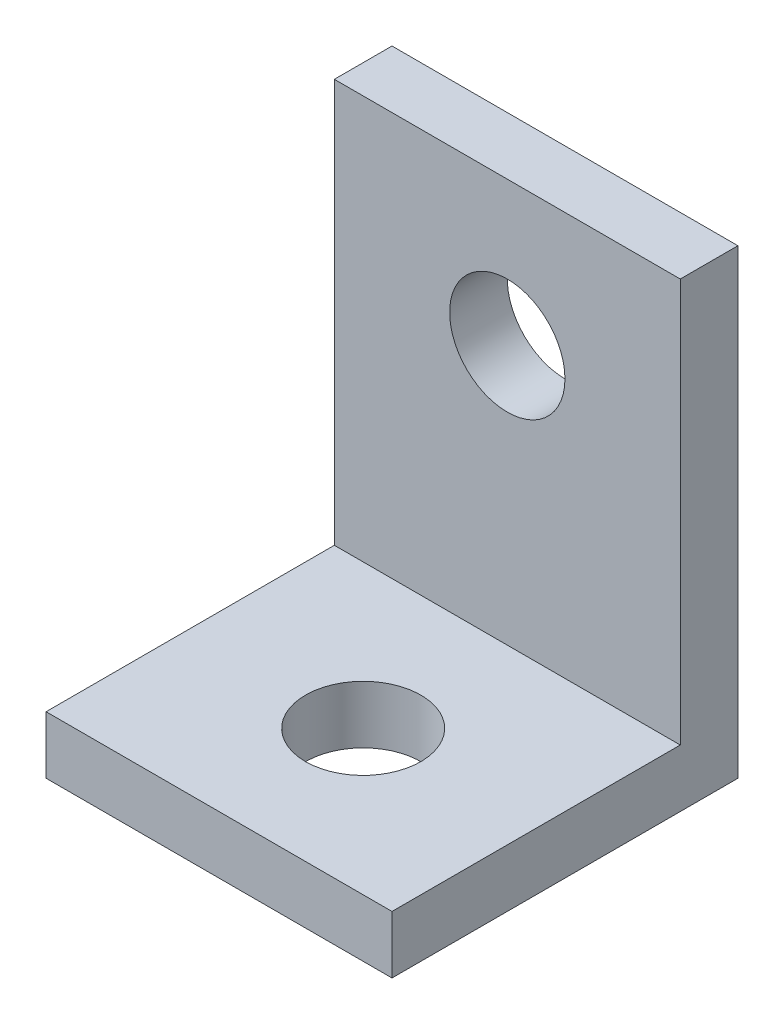
ISO-10303-21;
HEADER;
FILE_DESCRIPTION(('STEP AP214'),'2;1');
FILE_NAME('part.step','',(''),(''),'','','');
FILE_SCHEMA(('AUTOMOTIVE_DESIGN { 1 0 10303 214 1 1 1 1 }'));
ENDSEC;
DATA;
#1=APPLICATION_CONTEXT('core data for automotive mechanical design processes');
#2=APPLICATION_PROTOCOL_DEFINITION('international standard','automotive_design',2000,#1);
#3=PRODUCT_CONTEXT('',#1,'mechanical');
#4=PRODUCT('Part','Part','',(#3));
#5=PRODUCT_RELATED_PRODUCT_CATEGORY('part','',(#4));
#6=PRODUCT_DEFINITION_FORMATION('','',#4);
#7=PRODUCT_DEFINITION_CONTEXT('part definition',#1,'design');
#8=PRODUCT_DEFINITION('design','',#6,#7);
#9=PRODUCT_DEFINITION_SHAPE('','',#8);
#10=(LENGTH_UNIT() NAMED_UNIT(*) SI_UNIT(.MILLI.,.METRE.));
#11=(NAMED_UNIT(*) PLANE_ANGLE_UNIT() SI_UNIT($,.RADIAN.));
#12=(NAMED_UNIT(*) SI_UNIT($,.STERADIAN.) SOLID_ANGLE_UNIT());
#13=UNCERTAINTY_MEASURE_WITH_UNIT(LENGTH_MEASURE(1.E-05),#10,'distance_accuracy_value','');
#14=(GEOMETRIC_REPRESENTATION_CONTEXT(3) GLOBAL_UNCERTAINTY_ASSIGNED_CONTEXT((#13)) GLOBAL_UNIT_ASSIGNED_CONTEXT((#10,
#11,#12)) REPRESENTATION_CONTEXT('',''));
#15=CARTESIAN_POINT('',(0.,0.,0.));
#16=DIRECTION('',(0.,0.,1.));
#17=DIRECTION('',(1.,0.,0.));
#18=AXIS2_PLACEMENT_3D('',#15,#16,#17);
#19=CARTESIAN_POINT('',(0.,3.175,0.));
#20=DIRECTION('',(1.,0.,0.));
#21=DIRECTION('',(0.,0.,-1.));
#22=AXIS2_PLACEMENT_3D('',#19,#20,#21);
#23=PLANE('',#22);
#24=DIRECTION('',(0.,0.,1.));
#25=VECTOR('',#24,1.);
#26=CARTESIAN_POINT('',(0.,0.,0.));
#27=LINE('',#26,#25);
#28=CARTESIAN_POINT('',(0.,0.,0.));
#29=VERTEX_POINT('',#28);
#30=CARTESIAN_POINT('',(0.,0.,19.05));
#31=VERTEX_POINT('',#30);
#32=EDGE_CURVE('E97',#29,#31,#27,.T.);
#33=ORIENTED_EDGE('',*,*,#32,.T.);
#34=DIRECTION('',(0.,-1.,0.));
#35=VECTOR('',#34,1.);
#36=CARTESIAN_POINT('',(0.,3.175,19.05));
#37=LINE('',#36,#35);
#38=CARTESIAN_POINT('',(0.,3.175,19.05));
#39=VERTEX_POINT('',#38);
#40=EDGE_CURVE('E11',#39,#31,#37,.T.);
#41=ORIENTED_EDGE('',*,*,#40,.F.);
#42=DIRECTION('',(0.,0.,1.));
#43=VECTOR('',#42,1.);
#44=CARTESIAN_POINT('',(0.,3.175,0.));
#45=LINE('',#44,#43);
#46=CARTESIAN_POINT('',(0.,3.175,3.175));
#47=VERTEX_POINT('',#46);
#48=EDGE_CURVE('E90',#47,#39,#45,.T.);
#49=ORIENTED_EDGE('',*,*,#48,.F.);
#50=DIRECTION('',(0.,-1.,0.));
#51=VECTOR('',#50,1.);
#52=CARTESIAN_POINT('',(0.,25.4,3.175));
#53=LINE('',#52,#51);
#54=CARTESIAN_POINT('',(0.,25.4,3.175));
#55=VERTEX_POINT('',#54);
#56=EDGE_CURVE('E105',#55,#47,#53,.T.);
#57=ORIENTED_EDGE('',*,*,#56,.F.);
#58=DIRECTION('',(0.,0.,1.));
#59=VECTOR('',#58,1.);
#60=CARTESIAN_POINT('',(0.,25.4,0.));
#61=LINE('',#60,#59);
#62=CARTESIAN_POINT('',(0.,25.4,0.));
#63=VERTEX_POINT('',#62);
#64=EDGE_CURVE('E100',#63,#55,#61,.T.);
#65=ORIENTED_EDGE('',*,*,#64,.F.);
#66=DIRECTION('',(0.,-1.,0.));
#67=VECTOR('',#66,1.);
#68=CARTESIAN_POINT('',(0.,3.175,0.));
#69=LINE('',#68,#67);
#70=EDGE_CURVE('E83',#63,#29,#69,.T.);
#71=ORIENTED_EDGE('',*,*,#70,.T.);
#72=EDGE_LOOP('',(#33,#41,#49,#57,#65,#71));
#73=FACE_BOUND('',#72,.T.);
#74=ADVANCED_FACE('F39',(#73),#23,.F.);
#75=CARTESIAN_POINT('',(0.,3.175,19.05));
#76=DIRECTION('',(0.,0.,-1.));
#77=DIRECTION('',(-1.,0.,0.));
#78=AXIS2_PLACEMENT_3D('',#75,#76,#77);
#79=PLANE('',#78);
#80=DIRECTION('',(1.,0.,0.));
#81=VECTOR('',#80,1.);
#82=CARTESIAN_POINT('',(0.,0.,19.05));
#83=LINE('',#82,#81);
#84=CARTESIAN_POINT('',(19.05,0.,19.05));
#85=VERTEX_POINT('',#84);
#86=EDGE_CURVE('E104',#31,#85,#83,.T.);
#87=ORIENTED_EDGE('',*,*,#86,.T.);
#88=DIRECTION('',(0.,-1.,0.));
#89=VECTOR('',#88,1.);
#90=CARTESIAN_POINT('',(19.05,3.175,19.05));
#91=LINE('',#90,#89);
#92=CARTESIAN_POINT('',(19.05,3.175,19.05));
#93=VERTEX_POINT('',#92);
#94=EDGE_CURVE('E46',#93,#85,#91,.T.);
#95=ORIENTED_EDGE('',*,*,#94,.F.);
#96=DIRECTION('',(1.,0.,0.));
#97=VECTOR('',#96,1.);
#98=CARTESIAN_POINT('',(0.,3.175,19.05));
#99=LINE('',#98,#97);
#100=EDGE_CURVE('E59',#39,#93,#99,.T.);
#101=ORIENTED_EDGE('',*,*,#100,.F.);
#102=ORIENTED_EDGE('',*,*,#40,.T.);
#103=EDGE_LOOP('',(#87,#95,#101,#102));
#104=FACE_BOUND('',#103,.T.);
#105=ADVANCED_FACE('F121',(#104),#79,.F.);
#106=CARTESIAN_POINT('',(19.05,3.175,0.));
#107=DIRECTION('',(-1.,0.,0.));
#108=DIRECTION('',(0.,0.,1.));
#109=AXIS2_PLACEMENT_3D('',#106,#107,#108);
#110=PLANE('',#109);
#111=DIRECTION('',(0.,0.,-1.));
#112=VECTOR('',#111,1.);
#113=CARTESIAN_POINT('',(19.05,0.,0.));
#114=LINE('',#113,#112);
#115=CARTESIAN_POINT('',(19.05,0.,0.));
#116=VERTEX_POINT('',#115);
#117=EDGE_CURVE('E91',#85,#116,#114,.T.);
#118=ORIENTED_EDGE('',*,*,#117,.T.);
#119=DIRECTION('',(0.,-1.,0.));
#120=VECTOR('',#119,1.);
#121=CARTESIAN_POINT('',(19.05,3.175,0.));
#122=LINE('',#121,#120);
#123=CARTESIAN_POINT('',(19.05,25.4,0.));
#124=VERTEX_POINT('',#123);
#125=EDGE_CURVE('E86',#124,#116,#122,.T.);
#126=ORIENTED_EDGE('',*,*,#125,.F.);
#127=DIRECTION('',(0.,0.,-1.));
#128=VECTOR('',#127,1.);
#129=CARTESIAN_POINT('',(19.05,25.4,0.));
#130=LINE('',#129,#128);
#131=CARTESIAN_POINT('',(19.05,25.4,3.175));
#132=VERTEX_POINT('',#131);
#133=EDGE_CURVE('E136',#132,#124,#130,.T.);
#134=ORIENTED_EDGE('',*,*,#133,.F.);
#135=DIRECTION('',(0.,-1.,0.));
#136=VECTOR('',#135,1.);
#137=CARTESIAN_POINT('',(19.05,25.4,3.175));
#138=LINE('',#137,#136);
#139=CARTESIAN_POINT('',(19.05,3.175,3.175));
#140=VERTEX_POINT('',#139);
#141=EDGE_CURVE('E109',#132,#140,#138,.T.);
#142=ORIENTED_EDGE('',*,*,#141,.T.);
#143=DIRECTION('',(0.,0.,-1.));
#144=VECTOR('',#143,1.);
#145=CARTESIAN_POINT('',(19.05,3.175,0.));
#146=LINE('',#145,#144);
#147=EDGE_CURVE('E101',#93,#140,#146,.T.);
#148=ORIENTED_EDGE('',*,*,#147,.F.);
#149=ORIENTED_EDGE('',*,*,#94,.T.);
#150=EDGE_LOOP('',(#118,#126,#134,#142,#148,#149));
#151=FACE_BOUND('',#150,.T.);
#152=ADVANCED_FACE('F118',(#151),#110,.F.);
#153=CARTESIAN_POINT('',(0.,3.175,0.));
#154=DIRECTION('',(0.,0.,1.));
#155=DIRECTION('',(1.,0.,0.));
#156=AXIS2_PLACEMENT_3D('',#153,#154,#155);
#157=PLANE('',#156);
#158=CARTESIAN_POINT('',(9.525,17.4625,0.));
#159=DIRECTION('',(0.,0.,1.));
#160=DIRECTION('',(1.,0.,0.));
#161=AXIS2_PLACEMENT_3D('',#158,#159,#160);
#162=CIRCLE('',#161,3.175);
#163=CARTESIAN_POINT('',(12.7,17.4625,0.));
#164=VERTEX_POINT('',#163);
#165=EDGE_CURVE('E232',#164,#164,#162,.F.);
#166=ORIENTED_EDGE('',*,*,#165,.F.);
#167=EDGE_LOOP('',(#166));
#168=FACE_BOUND('',#167,.T.);
#169=DIRECTION('',(-1.,0.,0.));
#170=VECTOR('',#169,1.);
#171=CARTESIAN_POINT('',(0.,0.,0.));
#172=LINE('',#171,#170);
#173=EDGE_CURVE('E79',#116,#29,#172,.T.);
#174=ORIENTED_EDGE('',*,*,#173,.T.);
#175=ORIENTED_EDGE('',*,*,#70,.F.);
#176=DIRECTION('',(-1.,0.,0.));
#177=VECTOR('',#176,1.);
#178=CARTESIAN_POINT('',(0.,25.4,0.));
#179=LINE('',#178,#177);
#180=EDGE_CURVE('E139',#124,#63,#179,.T.);
#181=ORIENTED_EDGE('',*,*,#180,.F.);
#182=ORIENTED_EDGE('',*,*,#125,.T.);
#183=EDGE_LOOP('',(#174,#175,#181,#182));
#184=FACE_BOUND('',#183,.T.);
#185=ADVANCED_FACE('F81',(#168,#184),#157,.F.);
#186=CARTESIAN_POINT('',(0.,3.175,0.));
#187=DIRECTION('',(0.,1.,0.));
#188=DIRECTION('',(0.,0.,1.));
#189=AXIS2_PLACEMENT_3D('',#186,#187,#188);
#190=PLANE('',#189);
#191=CARTESIAN_POINT('',(9.525,3.175,11.1125));
#192=DIRECTION('',(0.,1.,0.));
#193=DIRECTION('',(0.,0.,1.));
#194=AXIS2_PLACEMENT_3D('',#191,#192,#193);
#195=CIRCLE('',#194,3.175);
#196=CARTESIAN_POINT('',(9.525,3.175,14.2875));
#197=VERTEX_POINT('',#196);
#198=EDGE_CURVE('E235',#197,#197,#195,.T.);
#199=ORIENTED_EDGE('',*,*,#198,.F.);
#200=EDGE_LOOP('',(#199));
#201=FACE_BOUND('',#200,.T.);
#202=DIRECTION('',(1.,0.,0.));
#203=VECTOR('',#202,1.);
#204=CARTESIAN_POINT('',(0.,3.175,3.175));
#205=LINE('',#204,#203);
#206=EDGE_CURVE('E53',#47,#140,#205,.T.);
#207=ORIENTED_EDGE('',*,*,#206,.F.);
#208=ORIENTED_EDGE('',*,*,#48,.T.);
#209=ORIENTED_EDGE('',*,*,#100,.T.);
#210=ORIENTED_EDGE('',*,*,#147,.T.);
#211=EDGE_LOOP('',(#207,#208,#209,#210));
#212=FACE_BOUND('',#211,.T.);
#213=ADVANCED_FACE('F148',(#201,#212),#190,.T.);
#214=CARTESIAN_POINT('',(0.,0.,0.));
#215=DIRECTION('',(0.,1.,0.));
#216=DIRECTION('',(0.,0.,1.));
#217=AXIS2_PLACEMENT_3D('',#214,#215,#216);
#218=PLANE('',#217);
#219=CARTESIAN_POINT('',(9.525,0.,11.1125));
#220=DIRECTION('',(0.,1.,0.));
#221=DIRECTION('',(0.,0.,1.));
#222=AXIS2_PLACEMENT_3D('',#219,#220,#221);
#223=CIRCLE('',#222,3.175);
#224=CARTESIAN_POINT('',(9.525,0.,14.2875));
#225=VERTEX_POINT('',#224);
#226=EDGE_CURVE('E141',#225,#225,#223,.F.);
#227=ORIENTED_EDGE('',*,*,#226,.F.);
#228=EDGE_LOOP('',(#227));
#229=FACE_BOUND('',#228,.T.);
#230=ORIENTED_EDGE('',*,*,#32,.F.);
#231=ORIENTED_EDGE('',*,*,#173,.F.);
#232=ORIENTED_EDGE('',*,*,#117,.F.);
#233=ORIENTED_EDGE('',*,*,#86,.F.);
#234=EDGE_LOOP('',(#230,#231,#232,#233));
#235=FACE_BOUND('',#234,.T.);
#236=ADVANCED_FACE('F103',(#229,#235),#218,.F.);
#237=CARTESIAN_POINT('',(0.,25.4,3.175));
#238=DIRECTION('',(0.,0.,-1.));
#239=DIRECTION('',(-1.,0.,0.));
#240=AXIS2_PLACEMENT_3D('',#237,#238,#239);
#241=PLANE('',#240);
#242=CARTESIAN_POINT('',(9.525,17.4625,3.175));
#243=DIRECTION('',(0.,0.,1.));
#244=DIRECTION('',(1.,0.,0.));
#245=AXIS2_PLACEMENT_3D('',#242,#243,#244);
#246=CIRCLE('',#245,3.175);
#247=CARTESIAN_POINT('',(12.7,17.4625,3.175));
#248=VERTEX_POINT('',#247);
#249=EDGE_CURVE('E231',#248,#248,#246,.T.);
#250=ORIENTED_EDGE('',*,*,#249,.F.);
#251=EDGE_LOOP('',(#250));
#252=FACE_BOUND('',#251,.T.);
#253=ORIENTED_EDGE('',*,*,#206,.T.);
#254=ORIENTED_EDGE('',*,*,#141,.F.);
#255=DIRECTION('',(1.,0.,0.));
#256=VECTOR('',#255,1.);
#257=CARTESIAN_POINT('',(0.,25.4,3.175));
#258=LINE('',#257,#256);
#259=EDGE_CURVE('E130',#55,#132,#258,.T.);
#260=ORIENTED_EDGE('',*,*,#259,.F.);
#261=ORIENTED_EDGE('',*,*,#56,.T.);
#262=EDGE_LOOP('',(#253,#254,#260,#261));
#263=FACE_BOUND('',#262,.T.);
#264=ADVANCED_FACE('F126',(#252,#263),#241,.F.);
#265=CARTESIAN_POINT('',(0.,25.4,0.));
#266=DIRECTION('',(0.,1.,0.));
#267=DIRECTION('',(0.,0.,1.));
#268=AXIS2_PLACEMENT_3D('',#265,#266,#267);
#269=PLANE('',#268);
#270=ORIENTED_EDGE('',*,*,#64,.T.);
#271=ORIENTED_EDGE('',*,*,#259,.T.);
#272=ORIENTED_EDGE('',*,*,#133,.T.);
#273=ORIENTED_EDGE('',*,*,#180,.T.);
#274=EDGE_LOOP('',(#270,#271,#272,#273));
#275=FACE_BOUND('',#274,.T.);
#276=ADVANCED_FACE('F138',(#275),#269,.T.);
#277=CARTESIAN_POINT('',(9.525,-0.00100000000000013,11.1125));
#278=DIRECTION('',(0.,1.,0.));
#279=DIRECTION('',(0.,0.,1.));
#280=AXIS2_PLACEMENT_3D('',#277,#278,#279);
#281=CYLINDRICAL_SURFACE('',#280,3.175);
#282=ORIENTED_EDGE('',*,*,#198,.T.);
#283=EDGE_LOOP('',(#282));
#284=FACE_BOUND('',#283,.T.);
#285=ORIENTED_EDGE('',*,*,#226,.T.);
#286=EDGE_LOOP('',(#285));
#287=FACE_BOUND('',#286,.T.);
#288=ADVANCED_FACE('F183',(#284,#287),#281,.F.);
#289=CARTESIAN_POINT('',(9.525,17.4625,-0.00100000000000013));
#290=DIRECTION('',(0.,0.,1.));
#291=DIRECTION('',(1.,0.,0.));
#292=AXIS2_PLACEMENT_3D('',#289,#290,#291);
#293=CYLINDRICAL_SURFACE('',#292,3.175);
#294=ORIENTED_EDGE('',*,*,#249,.T.);
#295=EDGE_LOOP('',(#294));
#296=FACE_BOUND('',#295,.T.);
#297=ORIENTED_EDGE('',*,*,#165,.T.);
#298=EDGE_LOOP('',(#297));
#299=FACE_BOUND('',#298,.T.);
#300=ADVANCED_FACE('F196',(#296,#299),#293,.F.);
#301=CLOSED_SHELL('',(#74,#105,#152,#185,#213,#236,#264,#276,#288,#300));
#302=MANIFOLD_SOLID_BREP('B2',#301);
#303=ADVANCED_BREP_SHAPE_REPRESENTATION('',(#18,#302),#14);
#304=SHAPE_DEFINITION_REPRESENTATION(#9,#303);
ENDSEC;
END-ISO-10303-21;
